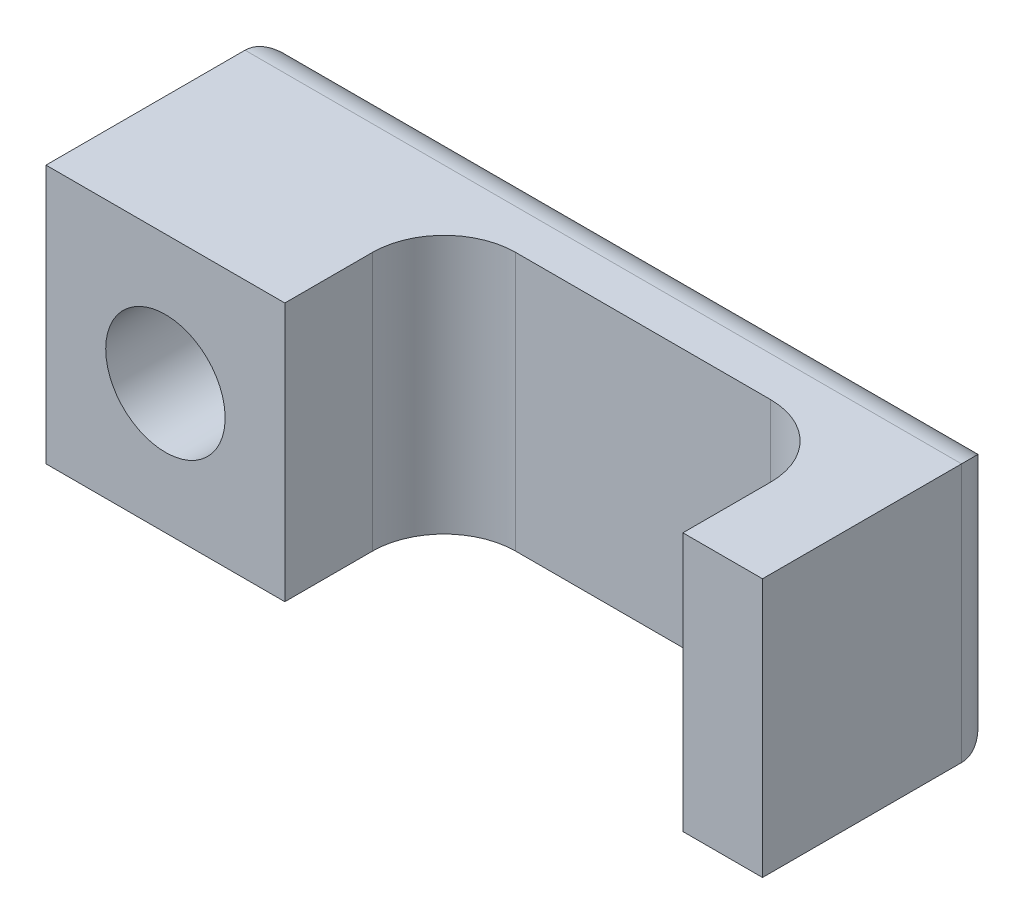
ISO-10303-21;
HEADER;
FILE_DESCRIPTION(('STEP AP214'),'2;1');
FILE_NAME('part.step','',(''),(''),'','','');
FILE_SCHEMA(('AUTOMOTIVE_DESIGN { 1 0 10303 214 1 1 1 1 }'));
ENDSEC;
DATA;
#1=APPLICATION_CONTEXT('core data for automotive mechanical design processes');
#2=APPLICATION_PROTOCOL_DEFINITION('international standard','automotive_design',2000,#1);
#3=PRODUCT_CONTEXT('',#1,'mechanical');
#4=PRODUCT('Part','Part','',(#3));
#5=PRODUCT_RELATED_PRODUCT_CATEGORY('part','',(#4));
#6=PRODUCT_DEFINITION_FORMATION('','',#4);
#7=PRODUCT_DEFINITION_CONTEXT('part definition',#1,'design');
#8=PRODUCT_DEFINITION('design','',#6,#7);
#9=PRODUCT_DEFINITION_SHAPE('','',#8);
#10=(LENGTH_UNIT() NAMED_UNIT(*) SI_UNIT(.MILLI.,.METRE.));
#11=(NAMED_UNIT(*) PLANE_ANGLE_UNIT() SI_UNIT($,.RADIAN.));
#12=(NAMED_UNIT(*) SI_UNIT($,.STERADIAN.) SOLID_ANGLE_UNIT());
#13=UNCERTAINTY_MEASURE_WITH_UNIT(LENGTH_MEASURE(1.E-05),#10,'distance_accuracy_value','');
#14=(GEOMETRIC_REPRESENTATION_CONTEXT(3) GLOBAL_UNCERTAINTY_ASSIGNED_CONTEXT((#13)) GLOBAL_UNIT_ASSIGNED_CONTEXT((#10,
#11,#12)) REPRESENTATION_CONTEXT('',''));
#15=CARTESIAN_POINT('',(0.,0.,0.));
#16=DIRECTION('',(0.,0.,1.));
#17=DIRECTION('',(1.,0.,0.));
#18=AXIS2_PLACEMENT_3D('',#15,#16,#17);
#19=CARTESIAN_POINT('',(0.,6.5,0.));
#20=DIRECTION('',(0.,0.,-1.));
#21=DIRECTION('',(-1.,0.,0.));
#22=AXIS2_PLACEMENT_3D('',#19,#20,#21);
#23=PLANE('',#22);
#24=CARTESIAN_POINT('',(3.,3.25,0.));
#25=DIRECTION('',(0.,0.,-1.));
#26=DIRECTION('',(-1.,0.,0.));
#27=AXIS2_PLACEMENT_3D('',#24,#25,#26);
#28=CIRCLE('',#27,1.5);
#29=CARTESIAN_POINT('',(1.5,3.25,0.));
#30=VERTEX_POINT('',#29);
#31=EDGE_CURVE('E160',#30,#30,#28,.T.);
#32=ORIENTED_EDGE('',*,*,#31,.T.);
#33=EDGE_LOOP('',(#32));
#34=FACE_BOUND('',#33,.T.);
#35=DIRECTION('',(0.,-1.,0.));
#36=VECTOR('',#35,1.);
#37=CARTESIAN_POINT('',(6.,6.5,0.));
#38=LINE('',#37,#36);
#39=CARTESIAN_POINT('',(6.,6.5,0.));
#40=VERTEX_POINT('',#39);
#41=CARTESIAN_POINT('',(6.,0.,0.));
#42=VERTEX_POINT('',#41);
#43=EDGE_CURVE('E127',#40,#42,#38,.T.);
#44=ORIENTED_EDGE('',*,*,#43,.F.);
#45=DIRECTION('',(1.,0.,0.));
#46=VECTOR('',#45,1.);
#47=CARTESIAN_POINT('',(0.,6.5,0.));
#48=LINE('',#47,#46);
#49=CARTESIAN_POINT('',(0.,6.5,0.));
#50=VERTEX_POINT('',#49);
#51=EDGE_CURVE('E140',#50,#40,#48,.T.);
#52=ORIENTED_EDGE('',*,*,#51,.F.);
#53=DIRECTION('',(0.,-1.,0.));
#54=VECTOR('',#53,1.);
#55=CARTESIAN_POINT('',(0.,6.5,0.));
#56=LINE('',#55,#54);
#57=CARTESIAN_POINT('',(0.,0.,0.));
#58=VERTEX_POINT('',#57);
#59=EDGE_CURVE('E167',#50,#58,#56,.T.);
#60=ORIENTED_EDGE('',*,*,#59,.T.);
#61=DIRECTION('',(1.,0.,0.));
#62=VECTOR('',#61,1.);
#63=CARTESIAN_POINT('',(0.,0.,0.));
#64=LINE('',#63,#62);
#65=EDGE_CURVE('E143',#58,#42,#64,.T.);
#66=ORIENTED_EDGE('',*,*,#65,.T.);
#67=EDGE_LOOP('',(#44,#52,#60,#66));
#68=FACE_BOUND('',#67,.T.);
#69=ADVANCED_FACE('F34',(#34,#68),#23,.F.);
#70=DIRECTION('',(0.,-1.,0.));
#71=VECTOR('',#70,1.);
#72=CARTESIAN_POINT('',(16.,6.5,0.));
#73=LINE('',#72,#71);
#74=CARTESIAN_POINT('',(16.,6.5,0.));
#75=VERTEX_POINT('',#74);
#76=CARTESIAN_POINT('',(16.,0.,0.));
#77=VERTEX_POINT('',#76);
#78=EDGE_CURVE('E145',#75,#77,#73,.T.);
#79=ORIENTED_EDGE('',*,*,#78,.T.);
#80=CARTESIAN_POINT('',(18.,0.,0.));
#81=VERTEX_POINT('',#80);
#82=EDGE_CURVE('E159',#77,#81,#64,.T.);
#83=ORIENTED_EDGE('',*,*,#82,.T.);
#84=DIRECTION('',(0.,-1.,0.));
#85=VECTOR('',#84,1.);
#86=CARTESIAN_POINT('',(18.,6.5,0.));
#87=LINE('',#86,#85);
#88=CARTESIAN_POINT('',(18.,6.5,0.));
#89=VERTEX_POINT('',#88);
#90=EDGE_CURVE('E152',#89,#81,#87,.T.);
#91=ORIENTED_EDGE('',*,*,#90,.F.);
#92=EDGE_CURVE('E150',#75,#89,#48,.T.);
#93=ORIENTED_EDGE('',*,*,#92,.F.);
#94=EDGE_LOOP('',(#79,#83,#91,#93));
#95=FACE_BOUND('',#94,.T.);
#96=ADVANCED_FACE('F245',(#95),#23,.F.);
#97=CARTESIAN_POINT('',(0.,6.5,0.));
#98=DIRECTION('',(0.,-1.,0.));
#99=DIRECTION('',(0.,0.,-1.));
#100=AXIS2_PLACEMENT_3D('',#97,#98,#99);
#101=PLANE('',#100);
#102=DIRECTION('',(0.,0.,-1.));
#103=VECTOR('',#102,1.);
#104=CARTESIAN_POINT('',(18.,6.5,0.));
#105=LINE('',#104,#103);
#106=CARTESIAN_POINT('',(18.,6.5,-5.));
#107=VERTEX_POINT('',#106);
#108=EDGE_CURVE('E149',#89,#107,#105,.T.);
#109=ORIENTED_EDGE('',*,*,#108,.T.);
#110=DIRECTION('',(-1.,0.,0.));
#111=VECTOR('',#110,1.);
#112=CARTESIAN_POINT('',(0.,6.5,-5.));
#113=LINE('',#112,#111);
#114=CARTESIAN_POINT('',(0.,6.5,-5.));
#115=VERTEX_POINT('',#114);
#116=EDGE_CURVE('E57',#107,#115,#113,.T.);
#117=ORIENTED_EDGE('',*,*,#116,.T.);
#118=DIRECTION('',(0.,0.,1.));
#119=VECTOR('',#118,1.);
#120=CARTESIAN_POINT('',(0.,6.5,0.));
#121=LINE('',#120,#119);
#122=EDGE_CURVE('E148',#115,#50,#121,.T.);
#123=ORIENTED_EDGE('',*,*,#122,.T.);
#124=ORIENTED_EDGE('',*,*,#51,.T.);
#125=DIRECTION('',(0.,0.,1.));
#126=VECTOR('',#125,1.);
#127=CARTESIAN_POINT('',(6.,6.5,-2.2));
#128=LINE('',#127,#126);
#129=CARTESIAN_POINT('',(6.,6.5,-2.2));
#130=VERTEX_POINT('',#129);
#131=EDGE_CURVE('E124',#130,#40,#128,.T.);
#132=ORIENTED_EDGE('',*,*,#131,.F.);
#133=CARTESIAN_POINT('',(7.8,6.5,-2.2));
#134=DIRECTION('',(0.,1.,0.));
#135=DIRECTION('',(0.,0.,-1.));
#136=AXIS2_PLACEMENT_3D('',#133,#134,#135);
#137=CIRCLE('',#136,1.8);
#138=CARTESIAN_POINT('',(7.8,6.5,-4.));
#139=VERTEX_POINT('',#138);
#140=EDGE_CURVE('E205',#139,#130,#137,.T.);
#141=ORIENTED_EDGE('',*,*,#140,.F.);
#142=DIRECTION('',(-1.,0.,0.));
#143=VECTOR('',#142,1.);
#144=CARTESIAN_POINT('',(14.2,6.5,-4.));
#145=LINE('',#144,#143);
#146=CARTESIAN_POINT('',(14.2,6.5,-4.));
#147=VERTEX_POINT('',#146);
#148=EDGE_CURVE('E300',#147,#139,#145,.T.);
#149=ORIENTED_EDGE('',*,*,#148,.F.);
#150=CARTESIAN_POINT('',(14.2,6.5,-2.2));
#151=DIRECTION('',(0.,1.,0.));
#152=DIRECTION('',(0.,0.,1.));
#153=AXIS2_PLACEMENT_3D('',#150,#151,#152);
#154=CIRCLE('',#153,1.8);
#155=CARTESIAN_POINT('',(16.,6.5,-2.2));
#156=VERTEX_POINT('',#155);
#157=EDGE_CURVE('E295',#156,#147,#154,.T.);
#158=ORIENTED_EDGE('',*,*,#157,.F.);
#159=DIRECTION('',(0.,0.,-1.));
#160=VECTOR('',#159,1.);
#161=CARTESIAN_POINT('',(16.,6.5,-2.2));
#162=LINE('',#161,#160);
#163=EDGE_CURVE('E133',#75,#156,#162,.T.);
#164=ORIENTED_EDGE('',*,*,#163,.F.);
#165=ORIENTED_EDGE('',*,*,#92,.T.);
#166=EDGE_LOOP('',(#109,#117,#123,#124,#132,#141,#149,#158,#164,#165));
#167=FACE_BOUND('',#166,.T.);
#168=ADVANCED_FACE('F147',(#167),#101,.F.);
#169=CARTESIAN_POINT('',(0.,0.,0.));
#170=DIRECTION('',(0.,-1.,0.));
#171=DIRECTION('',(0.,0.,-1.));
#172=AXIS2_PLACEMENT_3D('',#169,#170,#171);
#173=PLANE('',#172);
#174=DIRECTION('',(0.,0.,1.));
#175=VECTOR('',#174,1.);
#176=CARTESIAN_POINT('',(0.,0.,0.));
#177=LINE('',#176,#175);
#178=CARTESIAN_POINT('',(0.,0.,-5.));
#179=VERTEX_POINT('',#178);
#180=EDGE_CURVE('E157',#179,#58,#177,.T.);
#181=ORIENTED_EDGE('',*,*,#180,.F.);
#182=DIRECTION('',(-1.,0.,0.));
#183=VECTOR('',#182,1.);
#184=CARTESIAN_POINT('',(18.,0.,-5.));
#185=LINE('',#184,#183);
#186=CARTESIAN_POINT('',(18.,0.,-5.));
#187=VERTEX_POINT('',#186);
#188=EDGE_CURVE('E43',#179,#187,#185,.F.);
#189=ORIENTED_EDGE('',*,*,#188,.T.);
#190=DIRECTION('',(0.,0.,-1.));
#191=VECTOR('',#190,1.);
#192=CARTESIAN_POINT('',(18.,0.,0.));
#193=LINE('',#192,#191);
#194=EDGE_CURVE('E162',#81,#187,#193,.T.);
#195=ORIENTED_EDGE('',*,*,#194,.F.);
#196=ORIENTED_EDGE('',*,*,#82,.F.);
#197=DIRECTION('',(0.,0.,-1.));
#198=VECTOR('',#197,1.);
#199=CARTESIAN_POINT('',(16.,0.,-2.2));
#200=LINE('',#199,#198);
#201=CARTESIAN_POINT('',(16.,0.,-2.2));
#202=VERTEX_POINT('',#201);
#203=EDGE_CURVE('E197',#77,#202,#200,.T.);
#204=ORIENTED_EDGE('',*,*,#203,.T.);
#205=CARTESIAN_POINT('',(14.2,0.,-2.2));
#206=DIRECTION('',(0.,1.,0.));
#207=DIRECTION('',(0.,0.,1.));
#208=AXIS2_PLACEMENT_3D('',#205,#206,#207);
#209=CIRCLE('',#208,1.8);
#210=CARTESIAN_POINT('',(14.2,0.,-4.));
#211=VERTEX_POINT('',#210);
#212=EDGE_CURVE('E202',#202,#211,#209,.T.);
#213=ORIENTED_EDGE('',*,*,#212,.T.);
#214=DIRECTION('',(-1.,0.,0.));
#215=VECTOR('',#214,1.);
#216=CARTESIAN_POINT('',(14.2,0.,-4.));
#217=LINE('',#216,#215);
#218=CARTESIAN_POINT('',(7.8,0.,-4.));
#219=VERTEX_POINT('',#218);
#220=EDGE_CURVE('E210',#211,#219,#217,.T.);
#221=ORIENTED_EDGE('',*,*,#220,.T.);
#222=CARTESIAN_POINT('',(7.8,0.,-2.2));
#223=DIRECTION('',(0.,1.,0.));
#224=DIRECTION('',(0.,0.,-1.));
#225=AXIS2_PLACEMENT_3D('',#222,#223,#224);
#226=CIRCLE('',#225,1.8);
#227=CARTESIAN_POINT('',(6.,0.,-2.2));
#228=VERTEX_POINT('',#227);
#229=EDGE_CURVE('E134',#219,#228,#226,.T.);
#230=ORIENTED_EDGE('',*,*,#229,.T.);
#231=DIRECTION('',(0.,0.,1.));
#232=VECTOR('',#231,1.);
#233=CARTESIAN_POINT('',(6.,0.,-2.2));
#234=LINE('',#233,#232);
#235=EDGE_CURVE('E193',#228,#42,#234,.T.);
#236=ORIENTED_EDGE('',*,*,#235,.T.);
#237=ORIENTED_EDGE('',*,*,#65,.F.);
#238=EDGE_LOOP('',(#181,#189,#195,#196,#204,#213,#221,#230,#236,#237));
#239=FACE_BOUND('',#238,.T.);
#240=ADVANCED_FACE('F255',(#239),#173,.T.);
#241=CARTESIAN_POINT('',(0.,6.5,0.));
#242=DIRECTION('',(1.,0.,0.));
#243=DIRECTION('',(0.,0.,-1.));
#244=AXIS2_PLACEMENT_3D('',#241,#242,#243);
#245=PLANE('',#244);
#246=ORIENTED_EDGE('',*,*,#122,.F.);
#247=DIRECTION('',(0.,-1.,0.));
#248=VECTOR('',#247,1.);
#249=CARTESIAN_POINT('',(0.,6.5,-5.));
#250=LINE('',#249,#248);
#251=EDGE_CURVE('E11',#115,#179,#250,.T.);
#252=ORIENTED_EDGE('',*,*,#251,.T.);
#253=ORIENTED_EDGE('',*,*,#180,.T.);
#254=ORIENTED_EDGE('',*,*,#59,.F.);
#255=EDGE_LOOP('',(#246,#252,#253,#254));
#256=FACE_BOUND('',#255,.T.);
#257=ADVANCED_FACE('F240',(#256),#245,.F.);
#258=CARTESIAN_POINT('',(18.,6.5,0.));
#259=DIRECTION('',(-1.,0.,0.));
#260=DIRECTION('',(0.,0.,1.));
#261=AXIS2_PLACEMENT_3D('',#258,#259,#260);
#262=PLANE('',#261);
#263=ORIENTED_EDGE('',*,*,#194,.T.);
#264=DIRECTION('',(0.,-1.,0.));
#265=VECTOR('',#264,1.);
#266=CARTESIAN_POINT('',(18.,6.5,-5.));
#267=LINE('',#266,#265);
#268=EDGE_CURVE('E178',#187,#107,#267,.F.);
#269=ORIENTED_EDGE('',*,*,#268,.T.);
#270=ORIENTED_EDGE('',*,*,#108,.F.);
#271=ORIENTED_EDGE('',*,*,#90,.T.);
#272=EDGE_LOOP('',(#263,#269,#270,#271));
#273=FACE_BOUND('',#272,.T.);
#274=ADVANCED_FACE('F231',(#273),#262,.F.);
#275=CARTESIAN_POINT('',(0.,6.5,-6.));
#276=DIRECTION('',(0.,0.,1.));
#277=DIRECTION('',(1.,0.,0.));
#278=AXIS2_PLACEMENT_3D('',#275,#276,#277);
#279=PLANE('',#278);
#280=DIRECTION('',(-1.,0.,0.));
#281=VECTOR('',#280,1.);
#282=CARTESIAN_POINT('',(0.,5.5,-6.));
#283=LINE('',#282,#281);
#284=CARTESIAN_POINT('',(1.,5.5,-6.));
#285=VERTEX_POINT('',#284);
#286=CARTESIAN_POINT('',(17.,5.5,-6.));
#287=VERTEX_POINT('',#286);
#288=EDGE_CURVE('E173',#285,#287,#283,.F.);
#289=ORIENTED_EDGE('',*,*,#288,.T.);
#290=DIRECTION('',(0.,-1.,0.));
#291=VECTOR('',#290,1.);
#292=CARTESIAN_POINT('',(17.,6.5,-6.));
#293=LINE('',#292,#291);
#294=CARTESIAN_POINT('',(17.,1.,-6.));
#295=VERTEX_POINT('',#294);
#296=EDGE_CURVE('E175',#287,#295,#293,.T.);
#297=ORIENTED_EDGE('',*,*,#296,.T.);
#298=DIRECTION('',(-1.,0.,0.));
#299=VECTOR('',#298,1.);
#300=CARTESIAN_POINT('',(0.,1.,-6.));
#301=LINE('',#300,#299);
#302=CARTESIAN_POINT('',(1.,1.,-6.));
#303=VERTEX_POINT('',#302);
#304=EDGE_CURVE('E171',#295,#303,#301,.T.);
#305=ORIENTED_EDGE('',*,*,#304,.T.);
#306=DIRECTION('',(0.,-1.,0.));
#307=VECTOR('',#306,1.);
#308=CARTESIAN_POINT('',(1.,6.5,-6.));
#309=LINE('',#308,#307);
#310=EDGE_CURVE('E169',#303,#285,#309,.F.);
#311=ORIENTED_EDGE('',*,*,#310,.T.);
#312=EDGE_LOOP('',(#289,#297,#305,#311));
#313=FACE_BOUND('',#312,.T.);
#314=CARTESIAN_POINT('',(3.,3.25,-6.));
#315=DIRECTION('',(0.,0.,-1.));
#316=DIRECTION('',(-1.,0.,0.));
#317=AXIS2_PLACEMENT_3D('',#314,#315,#316);
#318=CIRCLE('',#317,1.5);
#319=CARTESIAN_POINT('',(1.5,3.25,-6.));
#320=VERTEX_POINT('',#319);
#321=EDGE_CURVE('E144',#320,#320,#318,.T.);
#322=ORIENTED_EDGE('',*,*,#321,.F.);
#323=EDGE_LOOP('',(#322));
#324=FACE_BOUND('',#323,.T.);
#325=ADVANCED_FACE('F229',(#313,#324),#279,.F.);
#326=CARTESIAN_POINT('',(3.,3.25,0.));
#327=DIRECTION('',(0.,0.,-1.));
#328=DIRECTION('',(-1.,0.,0.));
#329=AXIS2_PLACEMENT_3D('',#326,#327,#328);
#330=CYLINDRICAL_SURFACE('',#329,1.5);
#331=ORIENTED_EDGE('',*,*,#31,.F.);
#332=EDGE_LOOP('',(#331));
#333=FACE_BOUND('',#332,.T.);
#334=ORIENTED_EDGE('',*,*,#321,.T.);
#335=EDGE_LOOP('',(#334));
#336=FACE_BOUND('',#335,.T.);
#337=ADVANCED_FACE('F227',(#333,#336),#330,.F.);
#338=CARTESIAN_POINT('',(6.,6.5,-2.2));
#339=DIRECTION('',(1.,0.,0.));
#340=DIRECTION('',(0.,0.,-1.));
#341=AXIS2_PLACEMENT_3D('',#338,#339,#340);
#342=PLANE('',#341);
#343=ORIENTED_EDGE('',*,*,#235,.F.);
#344=DIRECTION('',(0.,-1.,0.));
#345=VECTOR('',#344,1.);
#346=CARTESIAN_POINT('',(6.,6.5,-2.2));
#347=LINE('',#346,#345);
#348=EDGE_CURVE('E130',#130,#228,#347,.T.);
#349=ORIENTED_EDGE('',*,*,#348,.F.);
#350=ORIENTED_EDGE('',*,*,#131,.T.);
#351=ORIENTED_EDGE('',*,*,#43,.T.);
#352=EDGE_LOOP('',(#343,#349,#350,#351));
#353=FACE_BOUND('',#352,.T.);
#354=ADVANCED_FACE('F126',(#353),#342,.T.);
#355=CARTESIAN_POINT('',(16.,6.5,-2.2));
#356=DIRECTION('',(-1.,0.,0.));
#357=DIRECTION('',(0.,0.,1.));
#358=AXIS2_PLACEMENT_3D('',#355,#356,#357);
#359=PLANE('',#358);
#360=ORIENTED_EDGE('',*,*,#203,.F.);
#361=ORIENTED_EDGE('',*,*,#78,.F.);
#362=ORIENTED_EDGE('',*,*,#163,.T.);
#363=DIRECTION('',(0.,-1.,0.));
#364=VECTOR('',#363,1.);
#365=CARTESIAN_POINT('',(16.,6.5,-2.2));
#366=LINE('',#365,#364);
#367=EDGE_CURVE('E219',#156,#202,#366,.T.);
#368=ORIENTED_EDGE('',*,*,#367,.T.);
#369=EDGE_LOOP('',(#360,#361,#362,#368));
#370=FACE_BOUND('',#369,.T.);
#371=ADVANCED_FACE('F287',(#370),#359,.T.);
#372=CARTESIAN_POINT('',(14.2,6.5,-2.2));
#373=DIRECTION('',(0.,-1.,0.));
#374=DIRECTION('',(0.,0.,-1.));
#375=AXIS2_PLACEMENT_3D('',#372,#373,#374);
#376=CYLINDRICAL_SURFACE('',#375,1.8);
#377=ORIENTED_EDGE('',*,*,#212,.F.);
#378=ORIENTED_EDGE('',*,*,#367,.F.);
#379=ORIENTED_EDGE('',*,*,#157,.T.);
#380=DIRECTION('',(0.,-1.,0.));
#381=VECTOR('',#380,1.);
#382=CARTESIAN_POINT('',(14.2,6.5,-4.));
#383=LINE('',#382,#381);
#384=EDGE_CURVE('E217',#147,#211,#383,.T.);
#385=ORIENTED_EDGE('',*,*,#384,.T.);
#386=EDGE_LOOP('',(#377,#378,#379,#385));
#387=FACE_BOUND('',#386,.T.);
#388=ADVANCED_FACE('F292',(#387),#376,.F.);
#389=CARTESIAN_POINT('',(14.2,6.5,-4.));
#390=DIRECTION('',(0.,0.,1.));
#391=DIRECTION('',(1.,0.,0.));
#392=AXIS2_PLACEMENT_3D('',#389,#390,#391);
#393=PLANE('',#392);
#394=ORIENTED_EDGE('',*,*,#220,.F.);
#395=ORIENTED_EDGE('',*,*,#384,.F.);
#396=ORIENTED_EDGE('',*,*,#148,.T.);
#397=DIRECTION('',(0.,-1.,0.));
#398=VECTOR('',#397,1.);
#399=CARTESIAN_POINT('',(7.8,6.5,-4.));
#400=LINE('',#399,#398);
#401=EDGE_CURVE('E215',#139,#219,#400,.T.);
#402=ORIENTED_EDGE('',*,*,#401,.T.);
#403=EDGE_LOOP('',(#394,#395,#396,#402));
#404=FACE_BOUND('',#403,.T.);
#405=ADVANCED_FACE('F272',(#404),#393,.T.);
#406=CARTESIAN_POINT('',(7.8,6.5,-2.2));
#407=DIRECTION('',(0.,-1.,0.));
#408=DIRECTION('',(0.,0.,-1.));
#409=AXIS2_PLACEMENT_3D('',#406,#407,#408);
#410=CYLINDRICAL_SURFACE('',#409,1.8);
#411=ORIENTED_EDGE('',*,*,#229,.F.);
#412=ORIENTED_EDGE('',*,*,#401,.F.);
#413=ORIENTED_EDGE('',*,*,#140,.T.);
#414=ORIENTED_EDGE('',*,*,#348,.T.);
#415=EDGE_LOOP('',(#411,#412,#413,#414));
#416=FACE_BOUND('',#415,.T.);
#417=ADVANCED_FACE('F267',(#416),#410,.F.);
#418=CARTESIAN_POINT('',(1.,6.5,-5.));
#419=DIRECTION('',(0.,-1.,0.));
#420=DIRECTION('',(0.,0.,-1.));
#421=AXIS2_PLACEMENT_3D('',#418,#419,#420);
#422=CYLINDRICAL_SURFACE('',#421,1.);
#423=CARTESIAN_POINT('',(1.,1.,-5.));
#424=DIRECTION('',(0.707106781186547,-0.707106781186547,0.));
#425=DIRECTION('',(-0.707106781186547,-0.707106781186547,0.));
#426=AXIS2_PLACEMENT_3D('',#423,#424,#425);
#427=ELLIPSE('',#426,1.41421356237309,1.);
#428=EDGE_CURVE('E186',#179,#303,#427,.T.);
#429=ORIENTED_EDGE('',*,*,#428,.F.);
#430=ORIENTED_EDGE('',*,*,#251,.F.);
#431=CARTESIAN_POINT('',(1.,5.5,-5.));
#432=DIRECTION('',(-0.707106781186547,-0.707106781186547,0.));
#433=DIRECTION('',(0.707106781186547,-0.707106781186547,0.));
#434=AXIS2_PLACEMENT_3D('',#431,#432,#433);
#435=ELLIPSE('',#434,1.41421356237309,1.);
#436=EDGE_CURVE('E38',#285,#115,#435,.F.);
#437=ORIENTED_EDGE('',*,*,#436,.F.);
#438=ORIENTED_EDGE('',*,*,#310,.F.);
#439=EDGE_LOOP('',(#429,#430,#437,#438));
#440=FACE_BOUND('',#439,.T.);
#441=ADVANCED_FACE('F36',(#440),#422,.T.);
#442=CARTESIAN_POINT('',(0.,5.5,-5.));
#443=DIRECTION('',(-1.,0.,0.));
#444=DIRECTION('',(0.,0.,1.));
#445=AXIS2_PLACEMENT_3D('',#442,#443,#444);
#446=CYLINDRICAL_SURFACE('',#445,1.);
#447=ORIENTED_EDGE('',*,*,#436,.T.);
#448=ORIENTED_EDGE('',*,*,#116,.F.);
#449=CARTESIAN_POINT('',(17.,5.5,-5.));
#450=DIRECTION('',(-0.707106781186547,0.707106781186547,0.));
#451=DIRECTION('',(-0.707106781186547,-0.707106781186547,0.));
#452=AXIS2_PLACEMENT_3D('',#449,#450,#451);
#453=ELLIPSE('',#452,1.41421356237309,1.);
#454=EDGE_CURVE('E185',#287,#107,#453,.F.);
#455=ORIENTED_EDGE('',*,*,#454,.F.);
#456=ORIENTED_EDGE('',*,*,#288,.F.);
#457=EDGE_LOOP('',(#447,#448,#455,#456));
#458=FACE_BOUND('',#457,.T.);
#459=ADVANCED_FACE('F262',(#458),#446,.T.);
#460=CARTESIAN_POINT('',(0.,1.,-5.));
#461=DIRECTION('',(1.,0.,0.));
#462=DIRECTION('',(0.,0.,-1.));
#463=AXIS2_PLACEMENT_3D('',#460,#461,#462);
#464=CYLINDRICAL_SURFACE('',#463,1.);
#465=ORIENTED_EDGE('',*,*,#428,.T.);
#466=ORIENTED_EDGE('',*,*,#304,.F.);
#467=CARTESIAN_POINT('',(17.,1.,-5.));
#468=DIRECTION('',(0.707106781186547,0.707106781186547,0.));
#469=DIRECTION('',(0.707106781186547,-0.707106781186547,0.));
#470=AXIS2_PLACEMENT_3D('',#467,#468,#469);
#471=ELLIPSE('',#470,1.41421356237309,1.);
#472=EDGE_CURVE('E183',#187,#295,#471,.T.);
#473=ORIENTED_EDGE('',*,*,#472,.F.);
#474=ORIENTED_EDGE('',*,*,#188,.F.);
#475=EDGE_LOOP('',(#465,#466,#473,#474));
#476=FACE_BOUND('',#475,.T.);
#477=ADVANCED_FACE('F259',(#476),#464,.T.);
#478=CARTESIAN_POINT('',(17.,6.5,-5.));
#479=DIRECTION('',(0.,-1.,0.));
#480=DIRECTION('',(0.,0.,-1.));
#481=AXIS2_PLACEMENT_3D('',#478,#479,#480);
#482=CYLINDRICAL_SURFACE('',#481,1.);
#483=ORIENTED_EDGE('',*,*,#454,.T.);
#484=ORIENTED_EDGE('',*,*,#268,.F.);
#485=ORIENTED_EDGE('',*,*,#472,.T.);
#486=ORIENTED_EDGE('',*,*,#296,.F.);
#487=EDGE_LOOP('',(#483,#484,#485,#486));
#488=FACE_BOUND('',#487,.T.);
#489=ADVANCED_FACE('F256',(#488),#482,.T.);
#490=CLOSED_SHELL('',(#69,#96,#168,#240,#257,#274,#325,#337,#354,#371,#388,#405,#417,#441,#459,
#477,#489));
#491=MANIFOLD_SOLID_BREP('B2',#490);
#492=ADVANCED_BREP_SHAPE_REPRESENTATION('',(#18,#491),#14);
#493=SHAPE_DEFINITION_REPRESENTATION(#9,#492);
ENDSEC;
END-ISO-10303-21;
